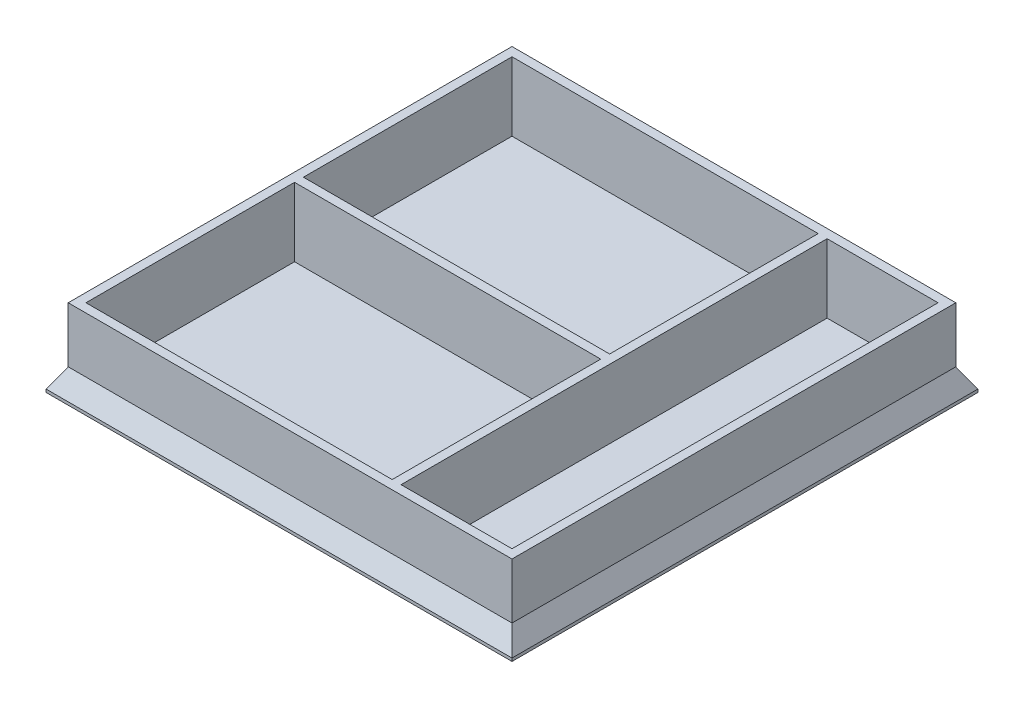
ISO-10303-21;
HEADER;
FILE_DESCRIPTION(('STEP AP214'),'2;1');
FILE_NAME('part.step','',(''),(''),'','','');
FILE_SCHEMA(('AUTOMOTIVE_DESIGN { 1 0 10303 214 1 1 1 1 }'));
ENDSEC;
DATA;
#1=APPLICATION_CONTEXT('core data for automotive mechanical design processes');
#2=APPLICATION_PROTOCOL_DEFINITION('international standard','automotive_design',2000,#1);
#3=PRODUCT_CONTEXT('',#1,'mechanical');
#4=PRODUCT('Part','Part','',(#3));
#5=PRODUCT_RELATED_PRODUCT_CATEGORY('part','',(#4));
#6=PRODUCT_DEFINITION_FORMATION('','',#4);
#7=PRODUCT_DEFINITION_CONTEXT('part definition',#1,'design');
#8=PRODUCT_DEFINITION('design','',#6,#7);
#9=PRODUCT_DEFINITION_SHAPE('','',#8);
#10=(LENGTH_UNIT() NAMED_UNIT(*) SI_UNIT(.MILLI.,.METRE.));
#11=(NAMED_UNIT(*) PLANE_ANGLE_UNIT() SI_UNIT($,.RADIAN.));
#12=(NAMED_UNIT(*) SI_UNIT($,.STERADIAN.) SOLID_ANGLE_UNIT());
#13=UNCERTAINTY_MEASURE_WITH_UNIT(LENGTH_MEASURE(1.E-05),#10,'distance_accuracy_value','');
#14=(GEOMETRIC_REPRESENTATION_CONTEXT(3) GLOBAL_UNCERTAINTY_ASSIGNED_CONTEXT((#13)) GLOBAL_UNIT_ASSIGNED_CONTEXT((#10,
#11,#12)) REPRESENTATION_CONTEXT('',''));
#15=CARTESIAN_POINT('',(0.,0.,0.));
#16=DIRECTION('',(0.,0.,1.));
#17=DIRECTION('',(1.,0.,0.));
#18=AXIS2_PLACEMENT_3D('',#15,#16,#17);
#19=CARTESIAN_POINT('',(0.,14.,-41.2));
#20=DIRECTION('',(0.,0.,-1.));
#21=DIRECTION('',(-1.,0.,0.));
#22=AXIS2_PLACEMENT_3D('',#19,#20,#21);
#23=PLANE('',#22);
#24=DIRECTION('',(-1.,0.,0.));
#25=VECTOR('',#24,1.);
#26=CARTESIAN_POINT('',(0.,1.6,-41.2));
#27=LINE('',#26,#25);
#28=CARTESIAN_POINT('',(-25.2,1.6,-41.2));
#29=VERTEX_POINT('',#28);
#30=CARTESIAN_POINT('',(-80.4,1.6,-41.2));
#31=VERTEX_POINT('',#30);
#32=EDGE_CURVE('E322',#29,#31,#27,.T.);
#33=ORIENTED_EDGE('',*,*,#32,.F.);
#34=DIRECTION('',(0.,-1.,0.));
#35=VECTOR('',#34,1.);
#36=CARTESIAN_POINT('',(-25.2,14.,-41.2));
#37=LINE('',#36,#35);
#38=CARTESIAN_POINT('',(-25.2,14.,-41.2));
#39=VERTEX_POINT('',#38);
#40=EDGE_CURVE('E264',#39,#29,#37,.T.);
#41=ORIENTED_EDGE('',*,*,#40,.F.);
#42=DIRECTION('',(1.,0.,0.));
#43=VECTOR('',#42,1.);
#44=CARTESIAN_POINT('',(0.,14.,-41.2));
#45=LINE('',#44,#43);
#46=CARTESIAN_POINT('',(-80.4,14.,-41.2));
#47=VERTEX_POINT('',#46);
#48=EDGE_CURVE('E243',#47,#39,#45,.T.);
#49=ORIENTED_EDGE('',*,*,#48,.F.);
#50=DIRECTION('',(0.,-1.,0.));
#51=VECTOR('',#50,1.);
#52=CARTESIAN_POINT('',(-80.4,14.,-41.2));
#53=LINE('',#52,#51);
#54=EDGE_CURVE('E254',#47,#31,#53,.T.);
#55=ORIENTED_EDGE('',*,*,#54,.T.);
#56=EDGE_LOOP('',(#33,#41,#49,#55));
#57=FACE_BOUND('',#56,.T.);
#58=ADVANCED_FACE('F37',(#57),#23,.F.);
#59=CARTESIAN_POINT('',(-25.2,14.,0.));
#60=DIRECTION('',(1.,0.,0.));
#61=DIRECTION('',(0.,0.,-1.));
#62=AXIS2_PLACEMENT_3D('',#59,#60,#61);
#63=PLANE('',#62);
#64=DIRECTION('',(0.,0.,-1.));
#65=VECTOR('',#64,1.);
#66=CARTESIAN_POINT('',(-25.2,1.6,0.));
#67=LINE('',#66,#65);
#68=CARTESIAN_POINT('',(-25.2,1.6,-3.6));
#69=VERTEX_POINT('',#68);
#70=EDGE_CURVE('E320',#69,#29,#67,.T.);
#71=ORIENTED_EDGE('',*,*,#70,.F.);
#72=DIRECTION('',(0.,-1.,0.));
#73=VECTOR('',#72,1.);
#74=CARTESIAN_POINT('',(-25.2,14.,-3.6));
#75=LINE('',#74,#73);
#76=CARTESIAN_POINT('',(-25.2,14.,-3.6));
#77=VERTEX_POINT('',#76);
#78=EDGE_CURVE('E261',#77,#69,#75,.T.);
#79=ORIENTED_EDGE('',*,*,#78,.F.);
#80=DIRECTION('',(0.,0.,1.));
#81=VECTOR('',#80,1.);
#82=CARTESIAN_POINT('',(-25.2,14.,0.));
#83=LINE('',#82,#81);
#84=EDGE_CURVE('E246',#39,#77,#83,.T.);
#85=ORIENTED_EDGE('',*,*,#84,.F.);
#86=ORIENTED_EDGE('',*,*,#40,.T.);
#87=EDGE_LOOP('',(#71,#79,#85,#86));
#88=FACE_BOUND('',#87,.T.);
#89=ADVANCED_FACE('F390',(#88),#63,.F.);
#90=CARTESIAN_POINT('',(0.,14.,-3.6));
#91=DIRECTION('',(0.,0.,-1.));
#92=DIRECTION('',(-1.,0.,0.));
#93=AXIS2_PLACEMENT_3D('',#90,#91,#92);
#94=PLANE('',#93);
#95=ORIENTED_EDGE('',*,*,#78,.T.);
#96=DIRECTION('',(-1.,0.,0.));
#97=VECTOR('',#96,1.);
#98=CARTESIAN_POINT('',(0.,1.6,-3.6));
#99=LINE('',#98,#97);
#100=CARTESIAN_POINT('',(-80.4,1.6,-3.6));
#101=VERTEX_POINT('',#100);
#102=EDGE_CURVE('E317',#69,#101,#99,.T.);
#103=ORIENTED_EDGE('',*,*,#102,.T.);
#104=DIRECTION('',(0.,-1.,0.));
#105=VECTOR('',#104,1.);
#106=CARTESIAN_POINT('',(-80.4,14.,-3.6));
#107=LINE('',#106,#105);
#108=CARTESIAN_POINT('',(-80.4,14.,-3.6));
#109=VERTEX_POINT('',#108);
#110=EDGE_CURVE('E257',#109,#101,#107,.T.);
#111=ORIENTED_EDGE('',*,*,#110,.F.);
#112=DIRECTION('',(1.,0.,0.));
#113=VECTOR('',#112,1.);
#114=CARTESIAN_POINT('',(0.,14.,-3.6));
#115=LINE('',#114,#113);
#116=EDGE_CURVE('E248',#109,#77,#115,.T.);
#117=ORIENTED_EDGE('',*,*,#116,.T.);
#118=EDGE_LOOP('',(#95,#103,#111,#117));
#119=FACE_BOUND('',#118,.T.);
#120=ADVANCED_FACE('F392',(#119),#94,.T.);
#121=CARTESIAN_POINT('',(0.,14.,-80.4));
#122=DIRECTION('',(0.,0.,-1.));
#123=DIRECTION('',(-1.,0.,0.));
#124=AXIS2_PLACEMENT_3D('',#121,#122,#123);
#125=PLANE('',#124);
#126=DIRECTION('',(-1.,0.,0.));
#127=VECTOR('',#126,1.);
#128=CARTESIAN_POINT('',(0.,1.6,-80.4));
#129=LINE('',#128,#127);
#130=CARTESIAN_POINT('',(-25.2,1.6,-80.4));
#131=VERTEX_POINT('',#130);
#132=CARTESIAN_POINT('',(-80.4,1.6,-80.4));
#133=VERTEX_POINT('',#132);
#134=EDGE_CURVE('E315',#131,#133,#129,.T.);
#135=ORIENTED_EDGE('',*,*,#134,.F.);
#136=DIRECTION('',(0.,-1.,0.));
#137=VECTOR('',#136,1.);
#138=CARTESIAN_POINT('',(-25.2,14.,-80.4));
#139=LINE('',#138,#137);
#140=CARTESIAN_POINT('',(-25.2,14.,-80.4));
#141=VERTEX_POINT('',#140);
#142=EDGE_CURVE('E258',#141,#131,#139,.T.);
#143=ORIENTED_EDGE('',*,*,#142,.F.);
#144=DIRECTION('',(1.,0.,0.));
#145=VECTOR('',#144,1.);
#146=CARTESIAN_POINT('',(0.,14.,-80.4));
#147=LINE('',#146,#145);
#148=CARTESIAN_POINT('',(-80.4,14.,-80.4));
#149=VERTEX_POINT('',#148);
#150=EDGE_CURVE('E232',#149,#141,#147,.T.);
#151=ORIENTED_EDGE('',*,*,#150,.F.);
#152=DIRECTION('',(0.,-1.,0.));
#153=VECTOR('',#152,1.);
#154=CARTESIAN_POINT('',(-80.4,14.,-80.4));
#155=LINE('',#154,#153);
#156=EDGE_CURVE('E268',#149,#133,#155,.T.);
#157=ORIENTED_EDGE('',*,*,#156,.T.);
#158=EDGE_LOOP('',(#135,#143,#151,#157));
#159=FACE_BOUND('',#158,.T.);
#160=ADVANCED_FACE('F429',(#159),#125,.F.);
#161=CARTESIAN_POINT('',(-25.2,14.,0.));
#162=DIRECTION('',(1.,0.,0.));
#163=DIRECTION('',(0.,0.,-1.));
#164=AXIS2_PLACEMENT_3D('',#161,#162,#163);
#165=PLANE('',#164);
#166=DIRECTION('',(0.,0.,-1.));
#167=VECTOR('',#166,1.);
#168=CARTESIAN_POINT('',(-25.2,1.6,0.));
#169=LINE('',#168,#167);
#170=CARTESIAN_POINT('',(-25.2,1.6,-42.8));
#171=VERTEX_POINT('',#170);
#172=EDGE_CURVE('E313',#171,#131,#169,.T.);
#173=ORIENTED_EDGE('',*,*,#172,.F.);
#174=DIRECTION('',(0.,-1.,0.));
#175=VECTOR('',#174,1.);
#176=CARTESIAN_POINT('',(-25.2,14.,-42.8));
#177=LINE('',#176,#175);
#178=CARTESIAN_POINT('',(-25.2,14.,-42.8));
#179=VERTEX_POINT('',#178);
#180=EDGE_CURVE('E275',#179,#171,#177,.T.);
#181=ORIENTED_EDGE('',*,*,#180,.F.);
#182=DIRECTION('',(0.,0.,1.));
#183=VECTOR('',#182,1.);
#184=CARTESIAN_POINT('',(-25.2,14.,0.));
#185=LINE('',#184,#183);
#186=EDGE_CURVE('E235',#141,#179,#185,.T.);
#187=ORIENTED_EDGE('',*,*,#186,.F.);
#188=ORIENTED_EDGE('',*,*,#142,.T.);
#189=EDGE_LOOP('',(#173,#181,#187,#188));
#190=FACE_BOUND('',#189,.T.);
#191=ADVANCED_FACE('F425',(#190),#165,.F.);
#192=CARTESIAN_POINT('',(0.,14.,-42.8));
#193=DIRECTION('',(0.,0.,-1.));
#194=DIRECTION('',(-1.,0.,0.));
#195=AXIS2_PLACEMENT_3D('',#192,#193,#194);
#196=PLANE('',#195);
#197=ORIENTED_EDGE('',*,*,#180,.T.);
#198=DIRECTION('',(-1.,0.,0.));
#199=VECTOR('',#198,1.);
#200=CARTESIAN_POINT('',(0.,1.6,-42.8));
#201=LINE('',#200,#199);
#202=CARTESIAN_POINT('',(-80.4,1.6,-42.8));
#203=VERTEX_POINT('',#202);
#204=EDGE_CURVE('E310',#171,#203,#201,.T.);
#205=ORIENTED_EDGE('',*,*,#204,.T.);
#206=DIRECTION('',(0.,-1.,0.));
#207=VECTOR('',#206,1.);
#208=CARTESIAN_POINT('',(-80.4,14.,-42.8));
#209=LINE('',#208,#207);
#210=CARTESIAN_POINT('',(-80.4,14.,-42.8));
#211=VERTEX_POINT('',#210);
#212=EDGE_CURVE('E271',#211,#203,#209,.T.);
#213=ORIENTED_EDGE('',*,*,#212,.F.);
#214=DIRECTION('',(1.,0.,0.));
#215=VECTOR('',#214,1.);
#216=CARTESIAN_POINT('',(0.,14.,-42.8));
#217=LINE('',#216,#215);
#218=EDGE_CURVE('E237',#211,#179,#217,.T.);
#219=ORIENTED_EDGE('',*,*,#218,.T.);
#220=EDGE_LOOP('',(#197,#205,#213,#219));
#221=FACE_BOUND('',#220,.T.);
#222=ADVANCED_FACE('F421',(#221),#196,.T.);
#223=CARTESIAN_POINT('',(0.,14.,-80.4));
#224=DIRECTION('',(0.,0.,-1.));
#225=DIRECTION('',(-1.,0.,0.));
#226=AXIS2_PLACEMENT_3D('',#223,#224,#225);
#227=PLANE('',#226);
#228=DIRECTION('',(-1.,0.,0.));
#229=VECTOR('',#228,1.);
#230=CARTESIAN_POINT('',(0.,1.6,-80.4));
#231=LINE('',#230,#229);
#232=CARTESIAN_POINT('',(-3.60000000000001,1.6,-80.4));
#233=VERTEX_POINT('',#232);
#234=CARTESIAN_POINT('',(-23.6,1.6,-80.4));
#235=VERTEX_POINT('',#234);
#236=EDGE_CURVE('E308',#233,#235,#231,.T.);
#237=ORIENTED_EDGE('',*,*,#236,.F.);
#238=DIRECTION('',(0.,-1.,0.));
#239=VECTOR('',#238,1.);
#240=CARTESIAN_POINT('',(-3.60000000000001,14.,-80.4));
#241=LINE('',#240,#239);
#242=CARTESIAN_POINT('',(-3.60000000000001,14.,-80.4));
#243=VERTEX_POINT('',#242);
#244=EDGE_CURVE('E272',#243,#233,#241,.T.);
#245=ORIENTED_EDGE('',*,*,#244,.F.);
#246=DIRECTION('',(1.,0.,0.));
#247=VECTOR('',#246,1.);
#248=CARTESIAN_POINT('',(0.,14.,-80.4));
#249=LINE('',#248,#247);
#250=CARTESIAN_POINT('',(-23.6,14.,-80.4));
#251=VERTEX_POINT('',#250);
#252=EDGE_CURVE('E221',#251,#243,#249,.T.);
#253=ORIENTED_EDGE('',*,*,#252,.F.);
#254=DIRECTION('',(0.,-1.,0.));
#255=VECTOR('',#254,1.);
#256=CARTESIAN_POINT('',(-23.6,14.,-80.4));
#257=LINE('',#256,#255);
#258=EDGE_CURVE('E198',#251,#235,#257,.T.);
#259=ORIENTED_EDGE('',*,*,#258,.T.);
#260=EDGE_LOOP('',(#237,#245,#253,#259));
#261=FACE_BOUND('',#260,.T.);
#262=ADVANCED_FACE('F424',(#261),#227,.F.);
#263=CARTESIAN_POINT('',(-3.6,14.,0.));
#264=DIRECTION('',(1.,0.,0.));
#265=DIRECTION('',(0.,0.,-1.));
#266=AXIS2_PLACEMENT_3D('',#263,#264,#265);
#267=PLANE('',#266);
#268=DIRECTION('',(0.,0.,-1.));
#269=VECTOR('',#268,1.);
#270=CARTESIAN_POINT('',(-3.6,1.6,0.));
#271=LINE('',#270,#269);
#272=CARTESIAN_POINT('',(-3.6,1.6,-3.6));
#273=VERTEX_POINT('',#272);
#274=EDGE_CURVE('E306',#273,#233,#271,.T.);
#275=ORIENTED_EDGE('',*,*,#274,.F.);
#276=DIRECTION('',(0.,-1.,0.));
#277=VECTOR('',#276,1.);
#278=CARTESIAN_POINT('',(-3.6,14.,-3.6));
#279=LINE('',#278,#277);
#280=CARTESIAN_POINT('',(-3.6,14.,-3.6));
#281=VERTEX_POINT('',#280);
#282=EDGE_CURVE('E285',#281,#273,#279,.T.);
#283=ORIENTED_EDGE('',*,*,#282,.F.);
#284=DIRECTION('',(0.,0.,1.));
#285=VECTOR('',#284,1.);
#286=CARTESIAN_POINT('',(-3.6,14.,0.));
#287=LINE('',#286,#285);
#288=EDGE_CURVE('E224',#243,#281,#287,.T.);
#289=ORIENTED_EDGE('',*,*,#288,.F.);
#290=ORIENTED_EDGE('',*,*,#244,.T.);
#291=EDGE_LOOP('',(#275,#283,#289,#290));
#292=FACE_BOUND('',#291,.T.);
#293=ADVANCED_FACE('F440',(#292),#267,.F.);
#294=CARTESIAN_POINT('',(0.,14.,-3.6));
#295=DIRECTION('',(0.,0.,-1.));
#296=DIRECTION('',(-1.,0.,0.));
#297=AXIS2_PLACEMENT_3D('',#294,#295,#296);
#298=PLANE('',#297);
#299=ORIENTED_EDGE('',*,*,#282,.T.);
#300=DIRECTION('',(-1.,0.,0.));
#301=VECTOR('',#300,1.);
#302=CARTESIAN_POINT('',(0.,1.6,-3.6));
#303=LINE('',#302,#301);
#304=CARTESIAN_POINT('',(-23.6,1.6,-3.6));
#305=VERTEX_POINT('',#304);
#306=EDGE_CURVE('E303',#273,#305,#303,.T.);
#307=ORIENTED_EDGE('',*,*,#306,.T.);
#308=DIRECTION('',(0.,-1.,0.));
#309=VECTOR('',#308,1.);
#310=CARTESIAN_POINT('',(-23.6,14.,-3.6));
#311=LINE('',#310,#309);
#312=CARTESIAN_POINT('',(-23.6,14.,-3.6));
#313=VERTEX_POINT('',#312);
#314=EDGE_CURVE('E282',#313,#305,#311,.T.);
#315=ORIENTED_EDGE('',*,*,#314,.F.);
#316=DIRECTION('',(1.,0.,0.));
#317=VECTOR('',#316,1.);
#318=CARTESIAN_POINT('',(0.,14.,-3.6));
#319=LINE('',#318,#317);
#320=EDGE_CURVE('E226',#313,#281,#319,.T.);
#321=ORIENTED_EDGE('',*,*,#320,.T.);
#322=EDGE_LOOP('',(#299,#307,#315,#321));
#323=FACE_BOUND('',#322,.T.);
#324=ADVANCED_FACE('F437',(#323),#298,.T.);
#325=CARTESIAN_POINT('',(-1.99999999999999,14.,0.));
#326=DIRECTION('',(1.,0.,0.));
#327=DIRECTION('',(0.,0.,-1.));
#328=AXIS2_PLACEMENT_3D('',#325,#326,#327);
#329=PLANE('',#328);
#330=DIRECTION('',(0.,0.,1.));
#331=VECTOR('',#330,1.);
#332=CARTESIAN_POINT('',(-1.99999999999999,4.,0.));
#333=LINE('',#332,#331);
#334=CARTESIAN_POINT('',(-1.99999999999999,4.,-82.));
#335=VERTEX_POINT('',#334);
#336=CARTESIAN_POINT('',(-1.99999999999999,4.,-1.99999999999999));
#337=VERTEX_POINT('',#336);
#338=EDGE_CURVE('E176',#335,#337,#333,.T.);
#339=ORIENTED_EDGE('',*,*,#338,.F.);
#340=DIRECTION('',(0.,-1.,0.));
#341=VECTOR('',#340,1.);
#342=CARTESIAN_POINT('',(-1.99999999999999,14.,-82.));
#343=LINE('',#342,#341);
#344=CARTESIAN_POINT('',(-1.99999999999999,14.,-82.));
#345=VERTEX_POINT('',#344);
#346=EDGE_CURVE('E180',#345,#335,#343,.T.);
#347=ORIENTED_EDGE('',*,*,#346,.F.);
#348=DIRECTION('',(0.,0.,1.));
#349=VECTOR('',#348,1.);
#350=CARTESIAN_POINT('',(-1.99999999999999,14.,0.));
#351=LINE('',#350,#349);
#352=CARTESIAN_POINT('',(-1.99999999999999,14.,-1.99999999999999));
#353=VERTEX_POINT('',#352);
#354=EDGE_CURVE('E214',#345,#353,#351,.T.);
#355=ORIENTED_EDGE('',*,*,#354,.T.);
#356=DIRECTION('',(0.,-1.,0.));
#357=VECTOR('',#356,1.);
#358=CARTESIAN_POINT('',(-1.99999999999999,14.,-1.99999999999999));
#359=LINE('',#358,#357);
#360=EDGE_CURVE('E183',#353,#337,#359,.T.);
#361=ORIENTED_EDGE('',*,*,#360,.T.);
#362=EDGE_LOOP('',(#339,#347,#355,#361));
#363=FACE_BOUND('',#362,.T.);
#364=ADVANCED_FACE('F178',(#363),#329,.T.);
#365=CARTESIAN_POINT('',(0.,14.,-82.));
#366=DIRECTION('',(0.,0.,-1.));
#367=DIRECTION('',(-1.,0.,0.));
#368=AXIS2_PLACEMENT_3D('',#365,#366,#367);
#369=PLANE('',#368);
#370=DIRECTION('',(1.,0.,0.));
#371=VECTOR('',#370,1.);
#372=CARTESIAN_POINT('',(0.,4.,-82.));
#373=LINE('',#372,#371);
#374=CARTESIAN_POINT('',(-82.,4.,-82.));
#375=VERTEX_POINT('',#374);
#376=EDGE_CURVE('E189',#375,#335,#373,.T.);
#377=ORIENTED_EDGE('',*,*,#376,.F.);
#378=DIRECTION('',(0.,-1.,0.));
#379=VECTOR('',#378,1.);
#380=CARTESIAN_POINT('',(-82.,14.,-82.));
#381=LINE('',#380,#379);
#382=CARTESIAN_POINT('',(-82.,14.,-82.));
#383=VERTEX_POINT('',#382);
#384=EDGE_CURVE('E199',#383,#375,#381,.T.);
#385=ORIENTED_EDGE('',*,*,#384,.F.);
#386=DIRECTION('',(1.,0.,0.));
#387=VECTOR('',#386,1.);
#388=CARTESIAN_POINT('',(0.,14.,-82.));
#389=LINE('',#388,#387);
#390=EDGE_CURVE('E197',#383,#345,#389,.T.);
#391=ORIENTED_EDGE('',*,*,#390,.T.);
#392=ORIENTED_EDGE('',*,*,#346,.T.);
#393=EDGE_LOOP('',(#377,#385,#391,#392));
#394=FACE_BOUND('',#393,.T.);
#395=ADVANCED_FACE('F193',(#394),#369,.T.);
#396=CARTESIAN_POINT('',(-82.,14.,0.));
#397=DIRECTION('',(1.,0.,0.));
#398=DIRECTION('',(0.,0.,-1.));
#399=AXIS2_PLACEMENT_3D('',#396,#397,#398);
#400=PLANE('',#399);
#401=ORIENTED_EDGE('',*,*,#384,.T.);
#402=DIRECTION('',(0.,0.,1.));
#403=VECTOR('',#402,1.);
#404=CARTESIAN_POINT('',(-82.,4.,0.));
#405=LINE('',#404,#403);
#406=CARTESIAN_POINT('',(-82.,4.,-2.));
#407=VERTEX_POINT('',#406);
#408=EDGE_CURVE('E211',#375,#407,#405,.T.);
#409=ORIENTED_EDGE('',*,*,#408,.T.);
#410=DIRECTION('',(0.,-1.,0.));
#411=VECTOR('',#410,1.);
#412=CARTESIAN_POINT('',(-82.,14.,-2.));
#413=LINE('',#412,#411);
#414=CARTESIAN_POINT('',(-82.,14.,-2.));
#415=VERTEX_POINT('',#414);
#416=EDGE_CURVE('E291',#415,#407,#413,.T.);
#417=ORIENTED_EDGE('',*,*,#416,.F.);
#418=DIRECTION('',(0.,0.,1.));
#419=VECTOR('',#418,1.);
#420=CARTESIAN_POINT('',(-82.,14.,0.));
#421=LINE('',#420,#419);
#422=EDGE_CURVE('E217',#383,#415,#421,.T.);
#423=ORIENTED_EDGE('',*,*,#422,.F.);
#424=EDGE_LOOP('',(#401,#409,#417,#423));
#425=FACE_BOUND('',#424,.T.);
#426=ADVANCED_FACE('F362',(#425),#400,.F.);
#427=CARTESIAN_POINT('',(-80.4,14.,0.));
#428=DIRECTION('',(1.,0.,0.));
#429=DIRECTION('',(0.,0.,-1.));
#430=AXIS2_PLACEMENT_3D('',#427,#428,#429);
#431=PLANE('',#430);
#432=ORIENTED_EDGE('',*,*,#212,.T.);
#433=DIRECTION('',(0.,0.,-1.));
#434=VECTOR('',#433,1.);
#435=CARTESIAN_POINT('',(-80.4,1.6,0.));
#436=LINE('',#435,#434);
#437=EDGE_CURVE('E300',#203,#133,#436,.T.);
#438=ORIENTED_EDGE('',*,*,#437,.T.);
#439=ORIENTED_EDGE('',*,*,#156,.F.);
#440=DIRECTION('',(0.,0.,1.));
#441=VECTOR('',#440,1.);
#442=CARTESIAN_POINT('',(-80.4,14.,0.));
#443=LINE('',#442,#441);
#444=EDGE_CURVE('E240',#149,#211,#443,.T.);
#445=ORIENTED_EDGE('',*,*,#444,.T.);
#446=EDGE_LOOP('',(#432,#438,#439,#445));
#447=FACE_BOUND('',#446,.T.);
#448=ADVANCED_FACE('F416',(#447),#431,.T.);
#449=CARTESIAN_POINT('',(-23.6,14.,0.));
#450=DIRECTION('',(1.,0.,0.));
#451=DIRECTION('',(0.,0.,-1.));
#452=AXIS2_PLACEMENT_3D('',#449,#450,#451);
#453=PLANE('',#452);
#454=ORIENTED_EDGE('',*,*,#314,.T.);
#455=DIRECTION('',(0.,0.,-1.));
#456=VECTOR('',#455,1.);
#457=CARTESIAN_POINT('',(-23.6,1.6,0.));
#458=LINE('',#457,#456);
#459=EDGE_CURVE('E297',#305,#235,#458,.T.);
#460=ORIENTED_EDGE('',*,*,#459,.T.);
#461=ORIENTED_EDGE('',*,*,#258,.F.);
#462=DIRECTION('',(0.,0.,1.));
#463=VECTOR('',#462,1.);
#464=CARTESIAN_POINT('',(-23.6,14.,0.));
#465=LINE('',#464,#463);
#466=EDGE_CURVE('E229',#251,#313,#465,.T.);
#467=ORIENTED_EDGE('',*,*,#466,.T.);
#468=EDGE_LOOP('',(#454,#460,#461,#467));
#469=FACE_BOUND('',#468,.T.);
#470=ADVANCED_FACE('F419',(#469),#453,.T.);
#471=CARTESIAN_POINT('',(0.,14.,-1.99999999999999));
#472=DIRECTION('',(0.,0.,-1.));
#473=DIRECTION('',(-1.,0.,0.));
#474=AXIS2_PLACEMENT_3D('',#471,#472,#473);
#475=PLANE('',#474);
#476=ORIENTED_EDGE('',*,*,#416,.T.);
#477=DIRECTION('',(1.,0.,0.));
#478=VECTOR('',#477,1.);
#479=CARTESIAN_POINT('',(0.,4.,-1.99999999999999));
#480=LINE('',#479,#478);
#481=EDGE_CURVE('E188',#407,#337,#480,.T.);
#482=ORIENTED_EDGE('',*,*,#481,.T.);
#483=ORIENTED_EDGE('',*,*,#360,.F.);
#484=DIRECTION('',(1.,0.,0.));
#485=VECTOR('',#484,1.);
#486=CARTESIAN_POINT('',(0.,14.,-1.99999999999999));
#487=LINE('',#486,#485);
#488=EDGE_CURVE('E219',#415,#353,#487,.T.);
#489=ORIENTED_EDGE('',*,*,#488,.F.);
#490=EDGE_LOOP('',(#476,#482,#483,#489));
#491=FACE_BOUND('',#490,.T.);
#492=ADVANCED_FACE('F365',(#491),#475,.F.);
#493=CARTESIAN_POINT('',(-80.4,14.,0.));
#494=DIRECTION('',(1.,0.,0.));
#495=DIRECTION('',(0.,0.,-1.));
#496=AXIS2_PLACEMENT_3D('',#493,#494,#495);
#497=PLANE('',#496);
#498=ORIENTED_EDGE('',*,*,#110,.T.);
#499=DIRECTION('',(0.,0.,-1.));
#500=VECTOR('',#499,1.);
#501=CARTESIAN_POINT('',(-80.4,1.6,0.));
#502=LINE('',#501,#500);
#503=EDGE_CURVE('E267',#101,#31,#502,.T.);
#504=ORIENTED_EDGE('',*,*,#503,.T.);
#505=ORIENTED_EDGE('',*,*,#54,.F.);
#506=DIRECTION('',(0.,0.,1.));
#507=VECTOR('',#506,1.);
#508=CARTESIAN_POINT('',(-80.4,14.,0.));
#509=LINE('',#508,#507);
#510=EDGE_CURVE('E251',#47,#109,#509,.T.);
#511=ORIENTED_EDGE('',*,*,#510,.T.);
#512=EDGE_LOOP('',(#498,#504,#505,#511));
#513=FACE_BOUND('',#512,.T.);
#514=ADVANCED_FACE('F371',(#513),#497,.T.);
#515=CARTESIAN_POINT('',(0.,14.,0.));
#516=DIRECTION('',(0.,1.,0.));
#517=DIRECTION('',(0.,0.,1.));
#518=AXIS2_PLACEMENT_3D('',#515,#516,#517);
#519=PLANE('',#518);
#520=ORIENTED_EDGE('',*,*,#354,.F.);
#521=ORIENTED_EDGE('',*,*,#390,.F.);
#522=ORIENTED_EDGE('',*,*,#422,.T.);
#523=ORIENTED_EDGE('',*,*,#488,.T.);
#524=EDGE_LOOP('',(#520,#521,#522,#523));
#525=FACE_BOUND('',#524,.T.);
#526=ORIENTED_EDGE('',*,*,#252,.T.);
#527=ORIENTED_EDGE('',*,*,#288,.T.);
#528=ORIENTED_EDGE('',*,*,#320,.F.);
#529=ORIENTED_EDGE('',*,*,#466,.F.);
#530=EDGE_LOOP('',(#526,#527,#528,#529));
#531=FACE_BOUND('',#530,.T.);
#532=ORIENTED_EDGE('',*,*,#150,.T.);
#533=ORIENTED_EDGE('',*,*,#186,.T.);
#534=ORIENTED_EDGE('',*,*,#218,.F.);
#535=ORIENTED_EDGE('',*,*,#444,.F.);
#536=EDGE_LOOP('',(#532,#533,#534,#535));
#537=FACE_BOUND('',#536,.T.);
#538=ORIENTED_EDGE('',*,*,#48,.T.);
#539=ORIENTED_EDGE('',*,*,#84,.T.);
#540=ORIENTED_EDGE('',*,*,#116,.F.);
#541=ORIENTED_EDGE('',*,*,#510,.F.);
#542=EDGE_LOOP('',(#538,#539,#540,#541));
#543=FACE_BOUND('',#542,.T.);
#544=ADVANCED_FACE('F367',(#525,#531,#537,#543),#519,.T.);
#545=CARTESIAN_POINT('',(0.,1.6,0.));
#546=DIRECTION('',(0.,1.,0.));
#547=DIRECTION('',(0.,0.,1.));
#548=AXIS2_PLACEMENT_3D('',#545,#546,#547);
#549=PLANE('',#548);
#550=ORIENTED_EDGE('',*,*,#70,.T.);
#551=ORIENTED_EDGE('',*,*,#32,.T.);
#552=ORIENTED_EDGE('',*,*,#503,.F.);
#553=ORIENTED_EDGE('',*,*,#102,.F.);
#554=EDGE_LOOP('',(#550,#551,#552,#553));
#555=FACE_BOUND('',#554,.T.);
#556=ADVANCED_FACE('F370',(#555),#549,.T.);
#557=ORIENTED_EDGE('',*,*,#274,.T.);
#558=ORIENTED_EDGE('',*,*,#236,.T.);
#559=ORIENTED_EDGE('',*,*,#459,.F.);
#560=ORIENTED_EDGE('',*,*,#306,.F.);
#561=EDGE_LOOP('',(#557,#558,#559,#560));
#562=FACE_BOUND('',#561,.T.);
#563=ADVANCED_FACE('F396',(#562),#549,.T.);
#564=ORIENTED_EDGE('',*,*,#172,.T.);
#565=ORIENTED_EDGE('',*,*,#134,.T.);
#566=ORIENTED_EDGE('',*,*,#437,.F.);
#567=ORIENTED_EDGE('',*,*,#204,.F.);
#568=EDGE_LOOP('',(#564,#565,#566,#567));
#569=FACE_BOUND('',#568,.T.);
#570=ADVANCED_FACE('F398',(#569),#549,.T.);
#571=CARTESIAN_POINT('',(0.,0.,0.));
#572=DIRECTION('',(0.,1.,0.));
#573=DIRECTION('',(0.,0.,1.));
#574=AXIS2_PLACEMENT_3D('',#571,#572,#573);
#575=PLANE('',#574);
#576=DIRECTION('',(0.,0.,-1.));
#577=VECTOR('',#576,1.);
#578=CARTESIAN_POINT('',(0.,0.,0.));
#579=LINE('',#578,#577);
#580=CARTESIAN_POINT('',(0.,0.,0.));
#581=VERTEX_POINT('',#580);
#582=CARTESIAN_POINT('',(0.,0.,-84.));
#583=VERTEX_POINT('',#582);
#584=EDGE_CURVE('E324',#581,#583,#579,.T.);
#585=ORIENTED_EDGE('',*,*,#584,.F.);
#586=DIRECTION('',(-1.,0.,0.));
#587=VECTOR('',#586,1.);
#588=CARTESIAN_POINT('',(0.,0.,0.));
#589=LINE('',#588,#587);
#590=CARTESIAN_POINT('',(-84.,0.,0.));
#591=VERTEX_POINT('',#590);
#592=EDGE_CURVE('E333',#581,#591,#589,.T.);
#593=ORIENTED_EDGE('',*,*,#592,.T.);
#594=DIRECTION('',(0.,0.,-1.));
#595=VECTOR('',#594,1.);
#596=CARTESIAN_POINT('',(-84.,0.,0.));
#597=LINE('',#596,#595);
#598=CARTESIAN_POINT('',(-84.,0.,-84.));
#599=VERTEX_POINT('',#598);
#600=EDGE_CURVE('E330',#591,#599,#597,.T.);
#601=ORIENTED_EDGE('',*,*,#600,.T.);
#602=DIRECTION('',(-1.,0.,0.));
#603=VECTOR('',#602,1.);
#604=CARTESIAN_POINT('',(0.,0.,-84.));
#605=LINE('',#604,#603);
#606=EDGE_CURVE('E327',#583,#599,#605,.T.);
#607=ORIENTED_EDGE('',*,*,#606,.F.);
#608=EDGE_LOOP('',(#585,#593,#601,#607));
#609=FACE_BOUND('',#608,.T.);
#610=ADVANCED_FACE('F406',(#609),#575,.F.);
#611=CARTESIAN_POINT('',(0.,1.6,-84.));
#612=DIRECTION('',(0.,0.,1.));
#613=DIRECTION('',(1.,0.,0.));
#614=AXIS2_PLACEMENT_3D('',#611,#612,#613);
#615=PLANE('',#614);
#616=DIRECTION('',(0.,-1.,0.));
#617=VECTOR('',#616,1.);
#618=CARTESIAN_POINT('',(-84.,1.6,-84.));
#619=LINE('',#618,#617);
#620=CARTESIAN_POINT('',(-84.,0.535898384862229,-84.));
#621=VERTEX_POINT('',#620);
#622=EDGE_CURVE('E340',#621,#599,#619,.T.);
#623=ORIENTED_EDGE('',*,*,#622,.F.);
#624=DIRECTION('',(1.,0.,0.));
#625=VECTOR('',#624,1.);
#626=CARTESIAN_POINT('',(0.,0.535898384862229,-84.));
#627=LINE('',#626,#625);
#628=CARTESIAN_POINT('',(0.,0.535898384862229,-84.));
#629=VERTEX_POINT('',#628);
#630=EDGE_CURVE('E62',#621,#629,#627,.T.);
#631=ORIENTED_EDGE('',*,*,#630,.T.);
#632=DIRECTION('',(0.,-1.,0.));
#633=VECTOR('',#632,1.);
#634=CARTESIAN_POINT('',(0.,1.6,-84.));
#635=LINE('',#634,#633);
#636=EDGE_CURVE('E342',#629,#583,#635,.T.);
#637=ORIENTED_EDGE('',*,*,#636,.T.);
#638=ORIENTED_EDGE('',*,*,#606,.T.);
#639=EDGE_LOOP('',(#623,#631,#637,#638));
#640=FACE_BOUND('',#639,.T.);
#641=ADVANCED_FACE('F515',(#640),#615,.F.);
#642=CARTESIAN_POINT('',(0.,1.6,0.));
#643=DIRECTION('',(-1.,0.,0.));
#644=DIRECTION('',(0.,0.,1.));
#645=AXIS2_PLACEMENT_3D('',#642,#643,#644);
#646=PLANE('',#645);
#647=ORIENTED_EDGE('',*,*,#636,.F.);
#648=DIRECTION('',(0.,0.,1.));
#649=VECTOR('',#648,1.);
#650=CARTESIAN_POINT('',(0.,0.535898384862229,0.));
#651=LINE('',#650,#649);
#652=CARTESIAN_POINT('',(0.,0.535898384862229,0.));
#653=VERTEX_POINT('',#652);
#654=EDGE_CURVE('E47',#629,#653,#651,.T.);
#655=ORIENTED_EDGE('',*,*,#654,.T.);
#656=DIRECTION('',(0.,-1.,0.));
#657=VECTOR('',#656,1.);
#658=CARTESIAN_POINT('',(0.,1.6,0.));
#659=LINE('',#658,#657);
#660=EDGE_CURVE('E336',#653,#581,#659,.T.);
#661=ORIENTED_EDGE('',*,*,#660,.T.);
#662=ORIENTED_EDGE('',*,*,#584,.T.);
#663=EDGE_LOOP('',(#647,#655,#661,#662));
#664=FACE_BOUND('',#663,.T.);
#665=ADVANCED_FACE('F524',(#664),#646,.F.);
#666=CARTESIAN_POINT('',(0.,1.6,0.));
#667=DIRECTION('',(0.,0.,1.));
#668=DIRECTION('',(1.,0.,0.));
#669=AXIS2_PLACEMENT_3D('',#666,#667,#668);
#670=PLANE('',#669);
#671=ORIENTED_EDGE('',*,*,#660,.F.);
#672=DIRECTION('',(-1.,0.,0.));
#673=VECTOR('',#672,1.);
#674=CARTESIAN_POINT('',(0.,0.535898384862229,0.));
#675=LINE('',#674,#673);
#676=CARTESIAN_POINT('',(-84.,0.535898384862229,0.));
#677=VERTEX_POINT('',#676);
#678=EDGE_CURVE('E11',#653,#677,#675,.T.);
#679=ORIENTED_EDGE('',*,*,#678,.T.);
#680=DIRECTION('',(0.,-1.,0.));
#681=VECTOR('',#680,1.);
#682=CARTESIAN_POINT('',(-84.,1.6,0.));
#683=LINE('',#682,#681);
#684=EDGE_CURVE('E338',#677,#591,#683,.T.);
#685=ORIENTED_EDGE('',*,*,#684,.T.);
#686=ORIENTED_EDGE('',*,*,#592,.F.);
#687=EDGE_LOOP('',(#671,#679,#685,#686));
#688=FACE_BOUND('',#687,.T.);
#689=ADVANCED_FACE('F530',(#688),#670,.T.);
#690=CARTESIAN_POINT('',(-84.,1.6,0.));
#691=DIRECTION('',(-1.,0.,0.));
#692=DIRECTION('',(0.,0.,1.));
#693=AXIS2_PLACEMENT_3D('',#690,#691,#692);
#694=PLANE('',#693);
#695=ORIENTED_EDGE('',*,*,#684,.F.);
#696=DIRECTION('',(0.,0.,-1.));
#697=VECTOR('',#696,1.);
#698=CARTESIAN_POINT('',(-84.,0.535898384862229,0.));
#699=LINE('',#698,#697);
#700=EDGE_CURVE('E344',#677,#621,#699,.T.);
#701=ORIENTED_EDGE('',*,*,#700,.T.);
#702=ORIENTED_EDGE('',*,*,#622,.T.);
#703=ORIENTED_EDGE('',*,*,#600,.F.);
#704=EDGE_LOOP('',(#695,#701,#702,#703));
#705=FACE_BOUND('',#704,.T.);
#706=ADVANCED_FACE('F537',(#705),#694,.T.);
#707=CARTESIAN_POINT('',(-2.00000000000001,4.,0.));
#708=DIRECTION('',(0.866025403784438,0.500000000000001,0.));
#709=DIRECTION('',(0.,0.,1.));
#710=AXIS2_PLACEMENT_3D('',#707,#708,#709);
#711=PLANE('',#710);
#712=DIRECTION('',(-0.447213595499959,0.774596669241484,0.447213595499956));
#713=VECTOR('',#712,1.);
#714=CARTESIAN_POINT('',(-18.4,32.4056332441295,-65.6000000000001));
#715=LINE('',#714,#713);
#716=EDGE_CURVE('E202',#335,#629,#715,.F.);
#717=ORIENTED_EDGE('',*,*,#716,.F.);
#718=ORIENTED_EDGE('',*,*,#338,.T.);
#719=DIRECTION('',(0.447213595499959,-0.774596669241483,0.447213595499959));
#720=VECTOR('',#719,1.);
#721=CARTESIAN_POINT('',(0.,0.535898384862229,0.));
#722=LINE('',#721,#720);
#723=EDGE_CURVE('E42',#653,#337,#722,.F.);
#724=ORIENTED_EDGE('',*,*,#723,.F.);
#725=ORIENTED_EDGE('',*,*,#654,.F.);
#726=EDGE_LOOP('',(#717,#718,#724,#725));
#727=FACE_BOUND('',#726,.T.);
#728=ADVANCED_FACE('F40',(#727),#711,.T.);
#729=CARTESIAN_POINT('',(0.,0.535898384862229,0.));
#730=DIRECTION('',(0.,-0.500000000000001,-0.866025403784438));
#731=DIRECTION('',(-1.,0.,0.));
#732=AXIS2_PLACEMENT_3D('',#729,#730,#731);
#733=PLANE('',#732);
#734=ORIENTED_EDGE('',*,*,#723,.T.);
#735=ORIENTED_EDGE('',*,*,#481,.F.);
#736=DIRECTION('',(-0.447213595499959,-0.774596669241483,0.447213595499959));
#737=VECTOR('',#736,1.);
#738=CARTESIAN_POINT('',(-67.2,29.6343519520194,-16.8000000000001));
#739=LINE('',#738,#737);
#740=EDGE_CURVE('E204',#677,#407,#739,.F.);
#741=ORIENTED_EDGE('',*,*,#740,.F.);
#742=ORIENTED_EDGE('',*,*,#678,.F.);
#743=EDGE_LOOP('',(#734,#735,#741,#742));
#744=FACE_BOUND('',#743,.T.);
#745=ADVANCED_FACE('F358',(#744),#733,.F.);
#746=CARTESIAN_POINT('',(0.,4.,-82.));
#747=DIRECTION('',(0.,0.499999999999998,-0.866025403784439));
#748=DIRECTION('',(1.,0.,0.));
#749=AXIS2_PLACEMENT_3D('',#746,#747,#748);
#750=PLANE('',#749);
#751=ORIENTED_EDGE('',*,*,#716,.T.);
#752=ORIENTED_EDGE('',*,*,#630,.F.);
#753=DIRECTION('',(-0.447213595499959,-0.774596669241483,-0.447213595499956));
#754=VECTOR('',#753,1.);
#755=CARTESIAN_POINT('',(-65.5999999999999,32.4056332441297,-65.6));
#756=LINE('',#755,#754);
#757=EDGE_CURVE('E207',#375,#621,#756,.T.);
#758=ORIENTED_EDGE('',*,*,#757,.F.);
#759=ORIENTED_EDGE('',*,*,#376,.T.);
#760=EDGE_LOOP('',(#751,#752,#758,#759));
#761=FACE_BOUND('',#760,.T.);
#762=ADVANCED_FACE('F206',(#761),#750,.T.);
#763=CARTESIAN_POINT('',(-84.,0.535898384862229,0.));
#764=DIRECTION('',(0.866025403784438,-0.500000000000001,0.));
#765=DIRECTION('',(0.,0.,-1.));
#766=AXIS2_PLACEMENT_3D('',#763,#764,#765);
#767=PLANE('',#766);
#768=ORIENTED_EDGE('',*,*,#740,.T.);
#769=ORIENTED_EDGE('',*,*,#408,.F.);
#770=ORIENTED_EDGE('',*,*,#757,.T.);
#771=ORIENTED_EDGE('',*,*,#700,.F.);
#772=EDGE_LOOP('',(#768,#769,#770,#771));
#773=FACE_BOUND('',#772,.T.);
#774=ADVANCED_FACE('F355',(#773),#767,.F.);
#775=CLOSED_SHELL('',(#58,#89,#120,#160,#191,#222,#262,#293,#324,#364,#395,#426,#448,#470,#492,
#514,#544,#556,#563,#570,#610,#641,#665,#689,#706,#728,#745,#762,#774));
#776=MANIFOLD_SOLID_BREP('B2',#775);
#777=ADVANCED_BREP_SHAPE_REPRESENTATION('',(#18,#776),#14);
#778=SHAPE_DEFINITION_REPRESENTATION(#9,#777);
ENDSEC;
END-ISO-10303-21;
